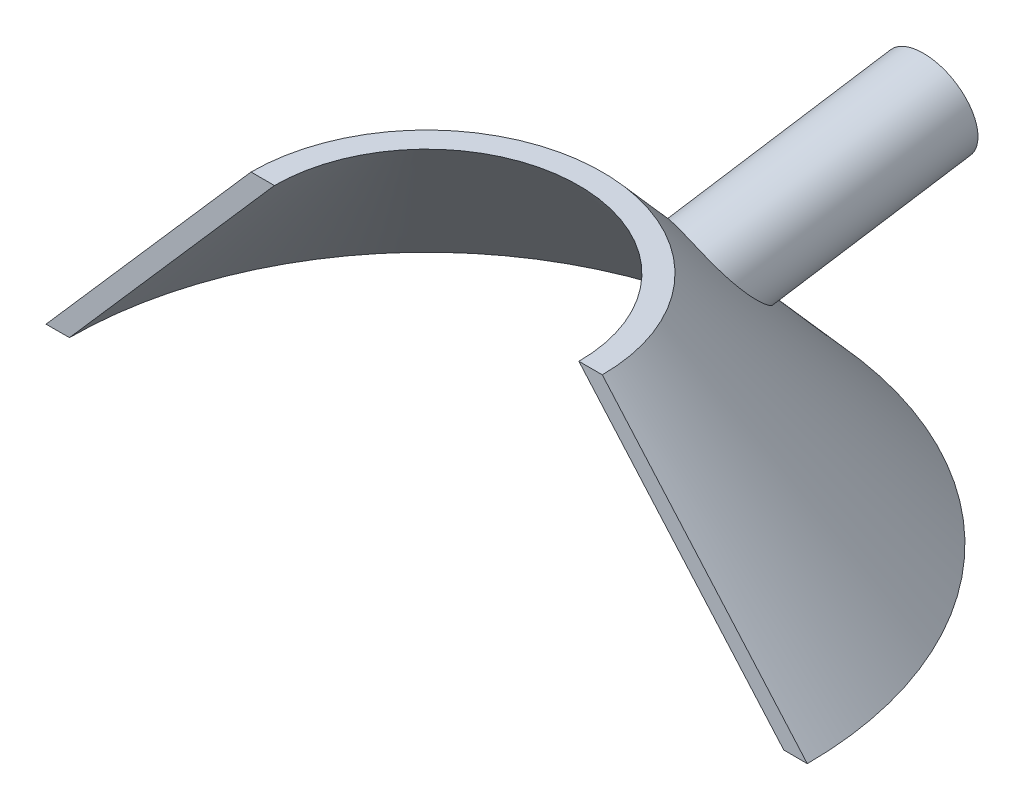
ISO-10303-21;
HEADER;
FILE_DESCRIPTION(('STEP AP214'),'2;1');
FILE_NAME('part.step','',(''),(''),'','','');
FILE_SCHEMA(('AUTOMOTIVE_DESIGN { 1 0 10303 214 1 1 1 1 }'));
ENDSEC;
DATA;
#1=APPLICATION_CONTEXT('core data for automotive mechanical design processes');
#2=APPLICATION_PROTOCOL_DEFINITION('international standard','automotive_design',2000,#1);
#3=PRODUCT_CONTEXT('',#1,'mechanical');
#4=PRODUCT('Part','Part','',(#3));
#5=PRODUCT_RELATED_PRODUCT_CATEGORY('part','',(#4));
#6=PRODUCT_DEFINITION_FORMATION('','',#4);
#7=PRODUCT_DEFINITION_CONTEXT('part definition',#1,'design');
#8=PRODUCT_DEFINITION('design','',#6,#7);
#9=PRODUCT_DEFINITION_SHAPE('','',#8);
#10=(LENGTH_UNIT() NAMED_UNIT(*) SI_UNIT(.MILLI.,.METRE.));
#11=(NAMED_UNIT(*) PLANE_ANGLE_UNIT() SI_UNIT($,.RADIAN.));
#12=(NAMED_UNIT(*) SI_UNIT($,.STERADIAN.) SOLID_ANGLE_UNIT());
#13=UNCERTAINTY_MEASURE_WITH_UNIT(LENGTH_MEASURE(1.E-05),#10,'distance_accuracy_value','');
#14=(GEOMETRIC_REPRESENTATION_CONTEXT(3) GLOBAL_UNCERTAINTY_ASSIGNED_CONTEXT((#13)) GLOBAL_UNIT_ASSIGNED_CONTEXT((#10,
#11,#12)) REPRESENTATION_CONTEXT('',''));
#15=CARTESIAN_POINT('',(0.,0.,0.));
#16=DIRECTION('',(0.,0.,1.));
#17=DIRECTION('',(1.,0.,0.));
#18=AXIS2_PLACEMENT_3D('',#15,#16,#17);
#19=CARTESIAN_POINT('',(-26.,40.,-1.81557029619843E-13));
#20=DIRECTION('',(0.,-1.,0.));
#21=DIRECTION('',(0.,0.,-1.));
#22=AXIS2_PLACEMENT_3D('',#19,#20,#21);
#23=PLANE('',#22);
#24=DIRECTION('',(-1.,0.,0.));
#25=VECTOR('',#24,1.);
#26=CARTESIAN_POINT('',(-26.,40.,0.));
#27=LINE('',#26,#25);
#28=CARTESIAN_POINT('',(30.,40.,0.));
#29=VERTEX_POINT('',#28);
#30=CARTESIAN_POINT('',(26.,40.,0.));
#31=VERTEX_POINT('',#30);
#32=EDGE_CURVE('E50',#29,#31,#27,.T.);
#33=ORIENTED_EDGE('',*,*,#32,.F.);
#34=CARTESIAN_POINT('',(0.,40.,0.));
#35=DIRECTION('',(0.,1.,0.));
#36=DIRECTION('',(0.,0.,1.));
#37=AXIS2_PLACEMENT_3D('',#34,#35,#36);
#38=CIRCLE('',#37,30.);
#39=CARTESIAN_POINT('',(-30.,40.,0.));
#40=VERTEX_POINT('',#39);
#41=EDGE_CURVE('E99',#29,#40,#38,.T.);
#42=ORIENTED_EDGE('',*,*,#41,.T.);
#43=CARTESIAN_POINT('',(-26.,40.,0.));
#44=VERTEX_POINT('',#43);
#45=EDGE_CURVE('E169',#44,#40,#27,.T.);
#46=ORIENTED_EDGE('',*,*,#45,.F.);
#47=CARTESIAN_POINT('',(0.,40.,0.));
#48=DIRECTION('',(0.,1.,0.));
#49=DIRECTION('',(0.,0.,1.));
#50=AXIS2_PLACEMENT_3D('',#47,#48,#49);
#51=CIRCLE('',#50,26.);
#52=EDGE_CURVE('E97',#31,#44,#51,.T.);
#53=ORIENTED_EDGE('',*,*,#52,.F.);
#54=EDGE_LOOP('',(#33,#42,#46,#53));
#55=FACE_BOUND('',#54,.T.);
#56=ADVANCED_FACE('F35',(#55),#23,.F.);
#57=CARTESIAN_POINT('',(0.,-0.0157867155627517,0.));
#58=DIRECTION('',(0.,-1.,0.));
#59=DIRECTION('',(0.,0.,-1.));
#60=AXIS2_PLACEMENT_3D('',#57,#58,#59);
#61=CONICAL_SURFACE('',#60,65.0138133761174,0.718829999621624);
#62=CARTESIAN_POINT('',(2.11778835466251,25.3432049363842,-42.7722986596035));
#63=CARTESIAN_POINT('',(2.05837024983885,25.5967091724343,-42.5531536370684));
#64=CARTESIAN_POINT('',(2.0146629317168,25.8519522119252,-42.3316314699707));
#65=CARTESIAN_POINT('',(1.95841450319368,26.3637883504045,-41.885929972183));
#66=CARTESIAN_POINT('',(1.94589586440639,26.6203822894098,-41.661748842477));
#67=CARTESIAN_POINT('',(1.95187543768074,27.1333207786515,-41.2121505340112));
#68=CARTESIAN_POINT('',(1.970454923976,27.3896629180138,-40.9867316558229));
#69=CARTESIAN_POINT('',(2.03860947993384,27.899124712044,-40.5370625812022));
#70=CARTESIAN_POINT('',(2.0881764502401,28.1522451911391,-40.3128120948202));
#71=CARTESIAN_POINT('',(2.21283021427869,28.6326337923969,-39.8851706809031));
#72=CARTESIAN_POINT('',(2.2855207178731,28.8603334331593,-39.6815632724077));
#73=CARTESIAN_POINT('',(2.45669351064718,29.3090979793261,-39.2779064826596));
#74=CARTESIAN_POINT('',(2.55517435628247,29.5301632552995,-39.0778569029361));
#75=CARTESIAN_POINT('',(2.7774942481713,29.9633265096628,-38.6827019920221));
#76=CARTESIAN_POINT('',(2.90130634245674,30.1754337322417,-38.4875916514895));
#77=CARTESIAN_POINT('',(3.17387087380948,30.5886800083893,-38.1032454051883));
#78=CARTESIAN_POINT('',(3.32262248176719,30.7898194262862,-37.9140093043797));
#79=CARTESIAN_POINT('',(3.6396122730346,31.1730146421218,-37.5480187771932));
#80=CARTESIAN_POINT('',(3.80714590347231,31.3554584285266,-37.371060812606));
#81=CARTESIAN_POINT('',(4.16414279177763,31.7055091467789,-37.02476144791));
#82=CARTESIAN_POINT('',(4.35360399083723,31.8731174689439,-36.8554193348086));
#83=CARTESIAN_POINT('',(4.75329438122443,32.191198196244,-36.5253594183006));
#84=CARTESIAN_POINT('',(4.963522627238,32.3416713806982,-36.3646412228476));
#85=CARTESIAN_POINT('',(5.40327991418681,32.6231734094234,-36.0528618035037));
#86=CARTESIAN_POINT('',(5.632806986843,32.7542042328528,-35.9017995975621));
#87=CARTESIAN_POINT('',(6.08833702681434,32.9839687799216,-35.6232662229043));
#88=CARTESIAN_POINT('',(6.31286485194527,33.0845318923771,-35.4948895087768));
#89=CARTESIAN_POINT('',(6.77487294009049,33.2659984399582,-35.2479370823975));
#90=CARTESIAN_POINT('',(7.01235147735112,33.3469044866957,-35.1293600695531));
#91=CARTESIAN_POINT('',(7.49838346454542,33.4875314474993,-34.9029908118166));
#92=CARTESIAN_POINT('',(7.74693342055622,33.5472589925125,-34.7951951988918));
#93=CARTESIAN_POINT('',(8.2531145036737,33.6441933470954,-34.5914285902636));
#94=CARTESIAN_POINT('',(8.51074457778745,33.6814027589884,-34.4954562292195));
#95=CARTESIAN_POINT('',(9.00568774952788,33.729501749745,-34.3258395843868));
#96=CARTESIAN_POINT('',(9.24233609958384,33.7427211992825,-34.2509118524185));
#97=CARTESIAN_POINT('',(9.71923099974895,33.7494509754894,-34.1125263103013));
#98=CARTESIAN_POINT('',(9.95947696950154,33.742964447698,-34.0490666712872));
#99=CARTESIAN_POINT('',(10.4414251090675,33.7098012887051,-33.9347365455134));
#100=CARTESIAN_POINT('',(10.6831262664857,33.683137375656,-33.8838581553682));
#101=CARTESIAN_POINT('',(11.1659147878287,33.609375414055,-33.7958202134505));
#102=CARTESIAN_POINT('',(11.4070022312597,33.5622801637345,-33.7586587843224));
#103=CARTESIAN_POINT('',(11.8583228902126,33.4543658537635,-33.702715582989));
#104=CARTESIAN_POINT('',(12.0688885578698,33.3957749895605,-33.6823008178056));
#105=CARTESIAN_POINT('',(12.4858763019324,33.26294755457,-33.6539524747895));
#106=CARTESIAN_POINT('',(12.6922990150258,33.1887134083168,-33.6460169644224));
#107=CARTESIAN_POINT('',(13.0989891406959,33.0251974368922,-33.6433628523612));
#108=CARTESIAN_POINT('',(13.2992616798211,32.9359285701146,-33.6486329226337));
#109=CARTESIAN_POINT('',(13.6919454591778,32.7431207642679,-33.6729557654406));
#110=CARTESIAN_POINT('',(13.8843574914651,32.6395832675833,-33.6920071456787));
#111=CARTESIAN_POINT('',(14.2387177149941,32.4315564157574,-33.7413585142388));
#112=CARTESIAN_POINT('',(14.4016810608831,32.328439815591,-33.7701807335052));
#113=CARTESIAN_POINT('',(14.7187453700452,32.1127799687993,-33.8390778808671));
#114=CARTESIAN_POINT('',(14.8728468504265,32.0002372731495,-33.8791521515778));
#115=CARTESIAN_POINT('',(15.1710945600556,31.7668584027662,-33.9704184098904));
#116=CARTESIAN_POINT('',(15.3152429289011,31.646024021683,-34.0216079981894));
#117=CARTESIAN_POINT('',(15.5927492613655,31.3972393957476,-34.1347872787403));
#118=CARTESIAN_POINT('',(15.7261071208545,31.2692890822459,-34.1967770751974));
#119=CARTESIAN_POINT('',(15.9770769699077,31.0119192639863,-34.3287910717432));
#120=CARTESIAN_POINT('',(16.0950674666382,30.8826935772534,-34.3984753289452));
#121=CARTESIAN_POINT('',(16.3199952934075,30.6198218451312,-34.5468906561284));
#122=CARTESIAN_POINT('',(16.4269290634093,30.4861743941952,-34.6256246228045));
#123=CARTESIAN_POINT('',(16.6294715516515,30.21557916167,-34.7914200478045));
#124=CARTESIAN_POINT('',(16.7250826522233,30.0786320816586,-34.8784797473706));
#125=CARTESIAN_POINT('',(16.9050017051711,29.8023250847853,-35.0602324243355));
#126=CARTESIAN_POINT('',(16.989305271919,29.6629642552762,-35.1549283407722));
#127=CARTESIAN_POINT('',(17.1542501466263,29.3692336314877,-35.3606225014161));
#128=CARTESIAN_POINT('',(17.2337567944512,29.2147109697508,-35.4723124617456));
#129=CARTESIAN_POINT('',(17.3795451549213,28.9048055477576,-35.7029453000408));
#130=CARTESIAN_POINT('',(17.4458224761187,28.7494225194369,-35.821890569342));
#131=CARTESIAN_POINT('',(17.6253592489131,28.2832299167748,-36.1881809476767));
#132=CARTESIAN_POINT('',(17.7193392744943,27.9723482081653,-36.4450007971442));
#133=CARTESIAN_POINT('',(17.8943517495434,27.2011470859002,-37.1100528157417));
#134=CARTESIAN_POINT('',(17.9454157289954,26.743828757027,-37.529786502159));
#135=CARTESIAN_POINT('',(17.9497766333613,26.0741400892618,-38.1758878803825));
#136=CARTESIAN_POINT('',(17.9391175299527,25.8532925436486,-38.3943600437689));
#137=CARTESIAN_POINT('',(17.894765442181,25.417709455813,-38.8351051410833));
#138=CARTESIAN_POINT('',(17.8610753433773,25.2029731514219,-39.0573775954708));
#139=CARTESIAN_POINT('',(17.7709002361369,24.7770785422509,-39.5074750528512));
#140=CARTESIAN_POINT('',(17.7140667417676,24.5660288255247,-39.7353325138944));
#141=CARTESIAN_POINT('',(17.5783981319223,24.1517393766909,-40.1915094309076));
#142=CARTESIAN_POINT('',(17.4995598494344,23.948500773582,-40.4198289486791));
#143=CARTESIAN_POINT('',(17.2312704979155,23.3525557445357,-41.1020075890175));
#144=CARTESIAN_POINT('',(17.0097115050135,22.9720744709512,-41.5547321704195));
#145=CARTESIAN_POINT('',(16.6694950479062,22.5063457277037,-42.1291099992976));
#146=CARTESIAN_POINT('',(16.5885593389116,22.4022364406057,-42.2589374707251));
#147=CARTESIAN_POINT('',(16.4193797948038,22.1975938706377,-42.5169647342816));
#148=CARTESIAN_POINT('',(16.3311281946354,22.0970645535357,-42.6451626259952));
#149=CARTESIAN_POINT('',(16.0701690866123,21.8170829392106,-43.0062871153867));
#150=CARTESIAN_POINT('',(15.8888181500308,21.6423099977999,-43.2366787567337));
#151=CARTESIAN_POINT('',(15.5014872719513,21.3077378000825,-43.6878077049118));
#152=CARTESIAN_POINT('',(15.2954908658262,21.1479486824168,-43.9085384216924));
#153=CARTESIAN_POINT('',(14.8590019900017,20.8456359085202,-44.3372320531009));
#154=CARTESIAN_POINT('',(14.6285144592933,20.7031087835166,-44.5451975287296));
#155=CARTESIAN_POINT('',(14.1432275956826,20.4379171069268,-44.9449589286064));
#156=CARTESIAN_POINT('',(13.8884336008603,20.3152482100498,-45.1367583858172));
#157=CARTESIAN_POINT('',(13.453598444329,20.1338861724111,-45.4331698034848));
#158=CARTESIAN_POINT('',(13.280560333028,20.0682638692168,-45.5438892241614));
#159=CARTESIAN_POINT('',(12.9255161627075,19.9471017574879,-45.7560954419741));
#160=CARTESIAN_POINT('',(12.7435116474726,19.8915602209645,-45.8575838199533));
#161=CARTESIAN_POINT('',(12.3712478259416,19.7915384762415,-46.0500360343663));
#162=CARTESIAN_POINT('',(12.1809947169344,19.747050127142,-46.1410075900922));
#163=CARTESIAN_POINT('',(11.7930205932267,19.6700637541708,-46.3112045685106));
#164=CARTESIAN_POINT('',(11.5953026681874,19.6375608282698,-46.3904347854539));
#165=CARTESIAN_POINT('',(11.1914659655391,19.5852031156248,-46.5366397659403));
#166=CARTESIAN_POINT('',(10.9852832849507,19.5654770658937,-46.6034850868748));
#167=CARTESIAN_POINT('',(10.5678952947204,19.5400628178475,-46.7227011232969));
#168=CARTESIAN_POINT('',(10.3566899444804,19.5343747330396,-46.7750717217429));
#169=CARTESIAN_POINT('',(9.93127107999039,19.5377262617303,-46.8642418576095));
#170=CARTESIAN_POINT('',(9.7170598746564,19.5467551252428,-46.9010527358887));
#171=CARTESIAN_POINT('',(9.28763756272839,19.5799473049075,-46.9583692694595));
#172=CARTESIAN_POINT('',(9.07242663413267,19.6041080222062,-46.9788777232748));
#173=CARTESIAN_POINT('',(8.67390088245117,19.6631168278983,-47.0014592977793));
#174=CARTESIAN_POINT('',(8.49040790346696,19.6959531966996,-47.0057416818314));
#175=CARTESIAN_POINT('',(8.12587090593842,19.772660428953,-47.002015731747));
#176=CARTESIAN_POINT('',(7.94482675807403,19.8165307073001,-46.9940080492118));
#177=CARTESIAN_POINT('',(7.58666006893805,19.9149581563703,-46.9659200783671));
#178=CARTESIAN_POINT('',(7.40953694252563,19.9695137203793,-46.9458416041678));
#179=CARTESIAN_POINT('',(7.06050604944184,20.0888123239716,-46.8940420037066));
#180=CARTESIAN_POINT('',(6.88859832965138,20.1535554550979,-46.8623207728225));
#181=CARTESIAN_POINT('',(6.55943418900087,20.2891869960531,-46.7896660131744));
#182=CARTESIAN_POINT('',(6.40187248233449,20.3596195392215,-46.749259358809));
#183=CARTESIAN_POINT('',(6.09331603354703,20.5085289344868,-46.6590786941264));
#184=CARTESIAN_POINT('',(5.94232337988668,20.587008318632,-46.6093017311696));
#185=CARTESIAN_POINT('',(5.64768780658295,20.7513105919431,-46.5011027943089));
#186=CARTESIAN_POINT('',(5.50404264688584,20.8371312213786,-46.4426834766237));
#187=CARTESIAN_POINT('',(5.22453028887082,21.0155000478554,-46.3178985882464));
#188=CARTESIAN_POINT('',(5.08866603481494,21.1080507618565,-46.2515300385828));
#189=CARTESIAN_POINT('',(4.81179699831234,21.3088952482027,-46.104499606923));
#190=CARTESIAN_POINT('',(4.67166652362596,21.4178339517896,-46.0230708319176));
#191=CARTESIAN_POINT('',(4.401707128341,21.6422285370255,-45.8524308040212));
#192=CARTESIAN_POINT('',(4.27188205228335,21.7576868236417,-45.7632166725332));
#193=CARTESIAN_POINT('',(3.89814970336614,22.1127486896058,-45.4851994735265));
#194=CARTESIAN_POINT('',(3.66999417731519,22.3610327708158,-45.2860264041852));
#195=CARTESIAN_POINT('',(3.21925300591958,22.921388764581,-44.8289053106564));
#196=CARTESIAN_POINT('',(3.00516021296432,23.2368692481921,-44.5668456574596));
#197=CARTESIAN_POINT('',(2.63652974875601,23.8842420695834,-44.0227225483765));
#198=CARTESIAN_POINT('',(2.48194009164208,24.2161197942593,-43.7406768099572));
#199=CARTESIAN_POINT('',(2.30809901092699,24.6833286935391,-43.3406916289912));
#200=CARTESIAN_POINT('',(2.26396820092174,24.8144609124958,-43.2281154307605));
#201=CARTESIAN_POINT('',(2.18438270375235,25.0779712106395,-43.0013433382213));
#202=CARTESIAN_POINT('',(2.14892799569913,25.210349286826,-42.8871474478131));
#203=CARTESIAN_POINT('',(2.11778835466251,25.3432049363842,-42.7722986596035));
#204=B_SPLINE_CURVE_WITH_KNOTS('',3,(#62,#63,#64,#65,#66,#67,#68,#69,#70,#71,#72,#73,#74,#75,
#76,#77,#78,#79,#80,#81,#82,#83,#84,#85,#86,#87,#88,#89,#90,#91,#92,#93,#94,#95,#96,#97,#98,#99,
#100,#101,#102,#103,#104,#105,#106,#107,#108,#109,#110,#111,#112,#113,#114,#115,#116,#117,#118,
#119,#120,#121,#122,#123,#124,#125,#126,#127,#128,#129,#130,#131,#132,#133,#134,#135,#136,#137,
#138,#139,#140,#141,#142,#143,#144,#145,#146,#147,#148,#149,#150,#151,#152,#153,#154,#155,#156,
#157,#158,#159,#160,#161,#162,#163,#164,#165,#166,#167,#168,#169,#170,#171,#172,#173,#174,#175,
#176,#177,#178,#179,#180,#181,#182,#183,#184,#185,#186,#187,#188,#189,#190,#191,#192,#193,#194,
#195,#196,#197,#198,#199,#200,#201,#202,#203),.UNSPECIFIED.,.T.,.F.,(4,2,2,2,2,2,2,2,2,2,2,2,2,
2,2,2,2,2,2,2,2,2,2,2,2,2,2,2,2,2,2,2,2,2,2,2,2,2,2,2,2,2,2,2,2,2,2,2,2,2,2,2,2,2,2,2,2,2,2,2,2,
2,2,2,2,2,2,2,2,2,4),(0.,1.02075736316887,2.04224997517305,3.06641640513355,4.09031525535915,
5.03115699062099,5.97194607607165,6.91173933728293,7.85150136143204,8.76353216631599,
9.67547740880056,10.5873811587353,11.4991920165509,12.3305707456418,13.1618389583696,
13.9928466723627,14.8237583320406,15.5684757538243,16.3130743073801,17.0572039182123,
17.8012316468385,18.4588761143528,19.1164187291763,19.7733974828202,20.4303098725706,
21.0145410032136,21.5987380080992,22.1828090359585,22.7668856995054,23.3313372471711,
23.8959699742808,24.4604836887129,25.0252157206079,25.6443365402706,26.2636625352886,
27.5022004123633,29.360003470032,30.2918261513293,31.2235321057068,32.1698191322717,
33.1162424223211,35.0023026217291,35.557368176232,36.1130306091114,37.135703654007,
38.1590637603433,39.1822178815213,40.2051478170728,40.8515772212006,41.4978957131361,
42.1437367575588,42.7893133597102,43.4412974315618,44.0932867751568,44.7448000869057,
45.3962015337371,45.9548466506888,46.5134621501173,47.0719937166249,47.6305303022435,
48.1617299184435,48.6930971998135,49.2243015039997,49.7557055033214,50.3409608162804,
50.9264334488787,52.097414377333,53.4804769740521,54.8623284785239,55.39728486092,
55.9322399553125),.UNSPECIFIED.);
#205=CARTESIAN_POINT('',(2.11778835466251,25.3432049363842,-42.7722986596035));
#206=VERTEX_POINT('',#205);
#207=EDGE_CURVE('E101',#206,#206,#204,.T.);
#208=ORIENTED_EDGE('',*,*,#207,.F.);
#209=EDGE_LOOP('',(#208));
#210=FACE_BOUND('',#209,.T.);
#211=DIRECTION('',(-0.658504607868518,-0.752576694706878,0.));
#212=VECTOR('',#211,1.);
#213=CARTESIAN_POINT('',(0.,74.2857142857143,0.));
#214=LINE('',#213,#212);
#215=CARTESIAN_POINT('',(-65.0138133761174,-0.0157867155627514,0.));
#216=VERTEX_POINT('',#215);
#217=EDGE_CURVE('E172',#40,#216,#214,.T.);
#218=ORIENTED_EDGE('',*,*,#217,.F.);
#219=ORIENTED_EDGE('',*,*,#41,.F.);
#220=DIRECTION('',(-0.658504607868518,0.752576694706878,0.));
#221=VECTOR('',#220,1.);
#222=CARTESIAN_POINT('',(0.,74.2857142857143,0.));
#223=LINE('',#222,#221);
#224=CARTESIAN_POINT('',(65.0138133761174,-0.0157867155627514,0.));
#225=VERTEX_POINT('',#224);
#226=EDGE_CURVE('E94',#225,#29,#223,.T.);
#227=ORIENTED_EDGE('',*,*,#226,.F.);
#228=CARTESIAN_POINT('',(0.,-0.0157867155627517,0.));
#229=DIRECTION('',(0.,1.,0.));
#230=DIRECTION('',(0.,0.,1.));
#231=AXIS2_PLACEMENT_3D('',#228,#229,#230);
#232=CIRCLE('',#231,65.0138133761174);
#233=EDGE_CURVE('E93',#225,#216,#232,.T.);
#234=ORIENTED_EDGE('',*,*,#233,.T.);
#235=EDGE_LOOP('',(#218,#219,#227,#234));
#236=FACE_BOUND('',#235,.T.);
#237=ADVANCED_FACE('F37',(#210,#236),#61,.T.);
#238=CARTESIAN_POINT('',(0.,0.,0.));
#239=DIRECTION('',(0.,-1.,0.));
#240=DIRECTION('',(0.,0.,-1.));
#241=AXIS2_PLACEMENT_3D('',#238,#239,#240);
#242=CONICAL_SURFACE('',#241,61.,1.56686325052021);
#243=DIRECTION('',(-0.999992265465479,-0.00393306613451107,0.));
#244=VECTOR('',#243,1.);
#245=CARTESIAN_POINT('',(0.,0.239918889866111,0.));
#246=LINE('',#245,#244);
#247=CARTESIAN_POINT('',(-61.,0.,0.));
#248=VERTEX_POINT('',#247);
#249=EDGE_CURVE('E57',#216,#248,#246,.F.);
#250=ORIENTED_EDGE('',*,*,#249,.F.);
#251=ORIENTED_EDGE('',*,*,#233,.F.);
#252=DIRECTION('',(-0.999992265465479,0.00393306613451107,0.));
#253=VECTOR('',#252,1.);
#254=CARTESIAN_POINT('',(0.,0.239918889866111,0.));
#255=LINE('',#254,#253);
#256=CARTESIAN_POINT('',(61.,0.,0.));
#257=VERTEX_POINT('',#256);
#258=EDGE_CURVE('E80',#257,#225,#255,.F.);
#259=ORIENTED_EDGE('',*,*,#258,.F.);
#260=CARTESIAN_POINT('',(0.,0.,0.));
#261=DIRECTION('',(0.,1.,0.));
#262=DIRECTION('',(0.,0.,1.));
#263=AXIS2_PLACEMENT_3D('',#260,#261,#262);
#264=CIRCLE('',#263,61.);
#265=EDGE_CURVE('E91',#257,#248,#264,.T.);
#266=ORIENTED_EDGE('',*,*,#265,.T.);
#267=EDGE_LOOP('',(#250,#251,#259,#266));
#268=FACE_BOUND('',#267,.T.);
#269=ADVANCED_FACE('F90',(#268),#242,.F.);
#270=CARTESIAN_POINT('',(0.,40.,0.));
#271=DIRECTION('',(0.,-1.,0.));
#272=DIRECTION('',(0.,0.,-1.));
#273=AXIS2_PLACEMENT_3D('',#270,#271,#272);
#274=CONICAL_SURFACE('',#273,26.,0.718829999621625);
#275=CARTESIAN_POINT('',(12.1313273111929,18.9037235749361,-42.7721297750715));
#276=CARTESIAN_POINT('',(11.7222017955815,19.0576283172528,-42.7481856846802));
#277=CARTESIAN_POINT('',(11.3107621343054,19.205444206621,-42.7251888818331));
#278=CARTESIAN_POINT('',(10.4831815569949,19.4879828385275,-42.6812322730921));
#279=CARTESIAN_POINT('',(10.0670393719394,19.622701947803,-42.6602730324516));
#280=CARTESIAN_POINT('',(8.8167339991327,20.0042088482922,-42.6009192037606));
#281=CARTESIAN_POINT('',(7.97585621409617,20.2301864790472,-42.5657622051148));
#282=CARTESIAN_POINT('',(6.70333011373241,20.5216600277175,-42.5204155257924));
#283=CARTESIAN_POINT('',(6.27712977404836,20.6109261635871,-42.5065277378402));
#284=CARTESIAN_POINT('',(5.42147387764977,20.7727837501532,-42.4813463650968));
#285=CARTESIAN_POINT('',(4.99201838818154,20.8453755443509,-42.4700527268646));
#286=CARTESIAN_POINT('',(4.12802744725613,20.9734857372074,-42.4501216838596));
#287=CARTESIAN_POINT('',(3.69347700663007,21.0289056088333,-42.4414996076603));
#288=CARTESIAN_POINT('',(2.82233332847799,21.1215588725451,-42.4270848593688));
#289=CARTESIAN_POINT('',(2.38573979829236,21.158789573301,-42.4212926059866));
#290=CARTESIAN_POINT('',(1.9485088405413,21.1866393430874,-42.4169598128893));
#291=B_SPLINE_CURVE_WITH_KNOTS('',3,(#275,#276,#277,#278,#279,#280,#281,#282,#283,#284,#285,
#286,#287,#288,#289,#290),.UNSPECIFIED.,.F.,.F.,(4,2,2,2,2,2,2,4),(0.,1.31318862591536,
2.62674051862443,5.23832680279947,6.54506890936445,7.85178409385778,9.16586359895152,
10.4801374807626),.UNSPECIFIED.);
#292=CARTESIAN_POINT('',(11.6444086546939,19.0835956707317,-42.7441457529045));
#293=VERTEX_POINT('',#292);
#294=CARTESIAN_POINT('',(4.63654231829645,20.8979935334507,-42.4618665600952));
#295=VERTEX_POINT('',#294);
#296=EDGE_CURVE('E107',#293,#295,#291,.T.);
#297=ORIENTED_EDGE('',*,*,#296,.F.);
#298=CARTESIAN_POINT('',(17.5858501149576,27.7677118481785,-32.2159369390578));
#299=CARTESIAN_POINT('',(17.641893817389,27.6060524066559,-32.3464938339182));
#300=CARTESIAN_POINT('',(17.69101114705,27.4448890309307,-32.480340340905));
#301=CARTESIAN_POINT('',(17.7759873145796,27.1239910518658,-32.7537433064809));
#302=CARTESIAN_POINT('',(17.8118501786835,26.9642560290541,-32.8932980167906));
#303=CARTESIAN_POINT('',(17.9347246229081,26.3036630396331,-33.4838757416615));
#304=CARTESIAN_POINT('',(17.9650458867184,25.8107341857407,-33.9569856134421));
#305=CARTESIAN_POINT('',(17.9275363206716,25.0940189347073,-34.6836189954293));
#306=CARTESIAN_POINT('',(17.9010326043935,24.8583408792107,-34.9292848241865));
#307=CARTESIAN_POINT('',(17.8215848843424,24.395165821934,-35.424156258061));
#308=CARTESIAN_POINT('',(17.7686474475553,24.1676668032588,-35.6733609690742));
#309=CARTESIAN_POINT('',(17.64017066331,23.730987722225,-36.1626458837421));
#310=CARTESIAN_POINT('',(17.5656649130884,23.5214393323096,-36.4026736515436));
#311=CARTESIAN_POINT('',(17.3940536525074,23.1112004434843,-36.8822496161259));
#312=CARTESIAN_POINT('',(17.2969473652604,22.9105102493549,-37.1217977961355));
#313=CARTESIAN_POINT('',(17.0806703579138,22.5189288135266,-37.5984606027076));
#314=CARTESIAN_POINT('',(16.9615230801696,22.3280274336064,-37.8355775349186));
#315=CARTESIAN_POINT('',(16.701315780218,21.9566578027316,-38.3059072174887));
#316=CARTESIAN_POINT('',(16.5602572227975,21.7761888554663,-38.5391202276745));
#317=CARTESIAN_POINT('',(16.2646538385391,21.4363940868881,-38.9870779696398));
#318=CARTESIAN_POINT('',(16.1112903938822,21.2764507731725,-39.2021297435249));
#319=CARTESIAN_POINT('',(15.7850574718227,20.9679500105285,-39.6253380773274));
#320=CARTESIAN_POINT('',(15.6121868610856,20.8193932239816,-39.8334942357109));
#321=CARTESIAN_POINT('',(15.0640901371721,20.3928338358945,-40.4446968008274));
#322=CARTESIAN_POINT('',(14.6588823502672,20.1333606462924,-40.8352451603248));
#323=CARTESIAN_POINT('',(14.0479214599143,19.8212355760025,-41.3349752422209));
#324=CARTESIAN_POINT('',(13.8750621460116,19.7403977854193,-41.4679450769151));
#325=CARTESIAN_POINT('',(13.5184090602065,19.5889517058532,-41.7248949515604));
#326=CARTESIAN_POINT('',(13.3346157390602,19.5183429955864,-41.848875361635));
#327=CARTESIAN_POINT('',(12.9567163373754,19.3885393331177,-42.0862655103206));
#328=CARTESIAN_POINT('',(12.7626198578036,19.3293339848761,-42.1996848278985));
#329=CARTESIAN_POINT('',(12.3646818379281,19.2234559328997,-42.4144982775228));
#330=CARTESIAN_POINT('',(12.1608456541487,19.1767764317187,-42.5158989150406));
#331=CARTESIAN_POINT('',(11.7805471107579,19.1040585429581,-42.6886605117413));
#332=CARTESIAN_POINT('',(11.6054789960655,19.0758432956848,-42.7621800542899));
#333=CARTESIAN_POINT('',(11.2501630024884,19.029467008078,-42.8989815843759));
#334=CARTESIAN_POINT('',(11.0699177655372,19.011300932185,-42.9622686880344));
#335=CARTESIAN_POINT('',(10.7051785799281,18.9856348025692,-43.0777429637237));
#336=CARTESIAN_POINT('',(10.5206853599753,18.9781329331429,-43.1299320240366));
#337=CARTESIAN_POINT('',(10.1486080297988,18.9743234259571,-43.2224197859266));
#338=CARTESIAN_POINT('',(9.96102388331483,18.9780159196141,-43.2627183479087));
#339=CARTESIAN_POINT('',(9.58314850958663,18.9970396089117,-43.3309447638005));
#340=CARTESIAN_POINT('',(9.39284816719612,19.0124329889902,-43.3588052555132));
#341=CARTESIAN_POINT('',(9.01210355343443,19.0551433544297,-43.4013716553148));
#342=CARTESIAN_POINT('',(8.82165928137112,19.0824603974979,-43.4160774997378));
#343=CARTESIAN_POINT('',(8.44232796712018,19.1490025589793,-43.4321186393438));
#344=CARTESIAN_POINT('',(8.25344064434585,19.1882254813419,-43.4334563987405));
#345=CARTESIAN_POINT('',(7.87886109225862,19.2783431836872,-43.4228275476798));
#346=CARTESIAN_POINT('',(7.69316866619523,19.3292372421437,-43.4108617594907));
#347=CARTESIAN_POINT('',(7.34275049823913,19.4372503004179,-43.3755921810569));
#348=CARTESIAN_POINT('',(7.17762063639311,19.4934235757052,-43.3533821662979));
#349=CARTESIAN_POINT('',(6.85235309695604,19.6146414716571,-43.2986000671906));
#350=CARTESIAN_POINT('',(6.69221711312973,19.6796890628545,-43.26602450826));
#351=CARTESIAN_POINT('',(6.3779958762032,19.818052619337,-43.191083357593));
#352=CARTESIAN_POINT('',(6.22390872554438,19.8913659632002,-43.1487208652634));
#353=CARTESIAN_POINT('',(5.92246052636435,20.0456799936158,-43.0548376541704));
#354=CARTESIAN_POINT('',(5.77510209357115,20.1266836326509,-43.0033134113173));
#355=CARTESIAN_POINT('',(5.48128805383848,20.2995347014819,-42.8893001374847));
#356=CARTESIAN_POINT('',(5.33517522212733,20.3917070013173,-42.8264203618907));
#357=CARTESIAN_POINT('',(5.05155888335633,20.582978985122,-42.6922744756736));
#358=CARTESIAN_POINT('',(4.91405847282574,20.6820811338681,-42.6210053749516));
#359=CARTESIAN_POINT('',(4.51513367330927,20.988669119752,-42.3958819478822));
#360=CARTESIAN_POINT('',(4.26714648370571,21.2055192606086,-42.230656258071));
#361=CARTESIAN_POINT('',(3.7729027287005,21.6943505408443,-41.8484251472135));
#362=CARTESIAN_POINT('',(3.5331029565376,21.9696301666225,-41.6273631842898));
#363=CARTESIAN_POINT('',(3.10456293424109,22.5392894440356,-41.1616687558146));
#364=CARTESIAN_POINT('',(2.91585562232328,22.8336812660188,-40.9170212222926));
#365=CARTESIAN_POINT('',(2.55698499169224,23.4949527660478,-40.361382520307));
#366=CARTESIAN_POINT('',(2.39771809175822,23.8647249448084,-40.0467903491353));
#367=CARTESIAN_POINT('',(2.15027405009179,24.6152709334517,-39.403148236864));
#368=CARTESIAN_POINT('',(2.06213865272438,24.9960510679195,-39.0740899253986));
#369=CARTESIAN_POINT('',(1.94740023399397,25.8226222886395,-38.3558287764995));
#370=CARTESIAN_POINT('',(1.93289447677394,26.2690698040329,-37.9654246038653));
#371=CARTESIAN_POINT('',(1.99717362656031,27.156236156298,-37.1847390332936));
#372=CARTESIAN_POINT('',(2.07603951703574,27.5969496845744,-36.7944580360321));
#373=CARTESIAN_POINT('',(2.26741853364505,28.2577120783075,-36.2036460701048));
#374=CARTESIAN_POINT('',(2.34699639542969,28.4846570100161,-35.999654034854));
#375=CARTESIAN_POINT('',(2.53205252062919,28.9313102314475,-35.5953186699012));
#376=CARTESIAN_POINT('',(2.63753500481402,29.151017335252,-35.3949759405186));
#377=CARTESIAN_POINT('',(2.87374192818346,29.5804603569414,-34.9995682875852));
#378=CARTESIAN_POINT('',(3.00441470503601,29.7902156061612,-34.8044934780322));
#379=CARTESIAN_POINT('',(3.29048728592884,30.1978351574387,-34.4203405350697));
#380=CARTESIAN_POINT('',(3.44587512734303,30.3957051487112,-34.2312595533481));
#381=CARTESIAN_POINT('',(3.77107461037281,30.7663941335834,-33.8705714259908));
#382=CARTESIAN_POINT('',(3.93956838671817,30.9399974276608,-33.6985814480021));
#383=CARTESIAN_POINT('',(4.29699576129194,31.2725382705567,-33.3615209354051));
#384=CARTESIAN_POINT('',(4.48593820108328,31.4314694199779,-33.1964534370725));
#385=CARTESIAN_POINT('',(4.85946058297569,31.7146174813342,-32.8932540091274));
#386=CARTESIAN_POINT('',(5.04190786097761,31.8407165381844,-32.7542470621552));
#387=CARTESIAN_POINT('',(5.4206965179715,32.0783638131608,-32.4828983562561));
#388=CARTESIAN_POINT('',(5.61703638348163,32.1899136125543,-32.3505558739718));
#389=CARTESIAN_POINT('',(6.02243510250834,32.397069125051,-32.0931404233665));
#390=CARTESIAN_POINT('',(6.23149195695469,32.4926773353269,-31.9680663184929));
#391=CARTESIAN_POINT('',(6.66094771310311,32.6666142292844,-31.7258563955582));
#392=CARTESIAN_POINT('',(6.88134045794331,32.7449521732586,-31.608716346726));
#393=CARTESIAN_POINT('',(7.28096368781417,32.8675061181632,-31.4086141492765));
#394=CARTESIAN_POINT('',(7.45820114916396,32.9154316003427,-31.3239233558725));
#395=CARTESIAN_POINT('',(7.81760172724815,32.9996787299002,-31.1601757860148));
#396=CARTESIAN_POINT('',(7.99975664829291,33.0360185305123,-31.0811103479078));
#397=CARTESIAN_POINT('',(8.1841485760151,33.0663594060956,-31.0049684035987));
#398=B_SPLINE_CURVE_WITH_KNOTS('',3,(#298,#299,#300,#301,#302,#303,#304,#305,#306,#307,#308,
#309,#310,#311,#312,#313,#314,#315,#316,#317,#318,#319,#320,#321,#322,#323,#324,#325,#326,#327,
#328,#329,#330,#331,#332,#333,#334,#335,#336,#337,#338,#339,#340,#341,#342,#343,#344,#345,#346,
#347,#348,#349,#350,#351,#352,#353,#354,#355,#356,#357,#358,#359,#360,#361,#362,#363,#364,#365,
#366,#367,#368,#369,#370,#371,#372,#373,#374,#375,#376,#377,#378,#379,#380,#381,#382,#383,#384,
#385,#386,#387,#388,#389,#390,#391,#392,#393,#394,#395,#396,#397),.UNSPECIFIED.,.F.,.F.,(4,2,2,
2,2,2,2,2,2,2,2,2,2,2,2,2,2,2,2,2,2,2,2,2,2,2,2,2,2,2,2,2,2,2,2,2,2,2,2,2,2,2,2,2,2,2,2,2,2,4),
(0.,0.645197013966096,1.29019787863055,3.32746640543209,4.35115939875008,5.37459820025886,
6.35539577612792,7.33622707164708,8.31602111063116,9.29574967775011,10.2211571578843,
11.146618430384,12.9943210649452,13.6916242182713,14.3888986450655,15.0855343510643,
15.7817912432005,16.3571244069956,16.9321690141806,17.5071157016954,18.0820691388424,
18.6600997204561,19.23813309961,19.8160599246806,20.3939510311162,20.9208429682154,
21.4479117085218,21.9748137606061,22.5019189270198,23.0528828849395,23.6040438138373,
24.7058572939414,25.9816555105846,27.25827425916,28.7852815605841,30.3131843540307,
32.0854803822732,33.8593146921229,34.8044010967789,35.749641591384,36.6929637456023,
37.6358306932114,38.5252229338072,39.4150012765658,40.1994192231989,40.9837518452047,
41.7679614896463,42.5517496137001,43.1578811450595,43.7630582267506),.UNSPECIFIED.);
#399=EDGE_CURVE('E86',#293,#295,#398,.T.);
#400=ORIENTED_EDGE('',*,*,#399,.T.);
#401=EDGE_LOOP('',(#297,#400));
#402=FACE_BOUND('',#401,.T.);
#403=CARTESIAN_POINT('',(6.32149907395029,21.3912016081101,-41.8074783950536));
#404=CARTESIAN_POINT('',(6.17088188614867,21.4844080076306,-41.747769844338));
#405=CARTESIAN_POINT('',(6.02550211329526,21.5824341542696,-41.6823009128445));
#406=CARTESIAN_POINT('',(5.74600869702646,21.7869428421676,-41.5411080387903));
#407=CARTESIAN_POINT('',(5.61190274913583,21.8934310647289,-41.4653771820648));
#408=CARTESIAN_POINT('',(5.35523006733637,22.1139462634595,-41.3047504456431));
#409=CARTESIAN_POINT('',(5.23269331501426,22.2279915903573,-41.2198319142398));
#410=CARTESIAN_POINT('',(4.99980460076511,22.4623172077811,-41.042185163235));
#411=CARTESIAN_POINT('',(4.88945847488202,22.5826004444533,-40.9494532402352));
#412=CARTESIAN_POINT('',(4.57884639841989,22.9490929609122,-40.6629671625317));
#413=CARTESIAN_POINT('',(4.39655528980938,23.2030855478704,-40.4593475540408));
#414=CARTESIAN_POINT('',(4.08061376915453,23.7246120506993,-40.0337594893816));
#415=CARTESIAN_POINT('',(3.94693532160513,23.9921380599452,-39.811801699998));
#416=CARTESIAN_POINT('',(3.70963990678926,24.5786123301985,-39.3192380580597));
#417=CARTESIAN_POINT('',(3.61407843960133,24.8990211132143,-39.0464774783437));
#418=CARTESIAN_POINT('',(3.48504558303685,25.5441764210853,-38.4914162431401));
#419=CARTESIAN_POINT('',(3.45162389501541,25.868926209114,-38.2091081348196));
#420=CARTESIAN_POINT('',(3.44528625180471,26.562329388066,-37.600460965588));
#421=CARTESIAN_POINT('',(3.48170077132734,26.9306238784045,-37.2735956293781));
#422=CARTESIAN_POINT('',(3.63271474366953,27.6542148640327,-36.6229891739191));
#423=CARTESIAN_POINT('',(3.74734166866083,28.0095067459282,-36.2992491929883));
#424=CARTESIAN_POINT('',(3.97970145708168,28.5317274436937,-35.8144311857994));
#425=CARTESIAN_POINT('',(4.06988072745402,28.7076781369439,-35.6494120873753));
#426=CARTESIAN_POINT('',(4.27062283199157,29.0512175025266,-35.3231580158645));
#427=CARTESIAN_POINT('',(4.38117753351295,29.2188094773633,-35.1619215618177));
#428=CARTESIAN_POINT('',(4.62220712452406,29.5439261362766,-34.8441023372284));
#429=CARTESIAN_POINT('',(4.75268960125233,29.7014469533486,-34.6875213664426));
#430=CARTESIAN_POINT('',(5.03279781441322,30.0044204299896,-34.3800857503518));
#431=CARTESIAN_POINT('',(5.18241373463663,30.1498792152129,-34.2292282198009));
#432=CARTESIAN_POINT('',(5.4927501257087,30.42059947375,-33.9408212404727));
#433=CARTESIAN_POINT('',(5.65265989842409,30.5464775718567,-33.8029785182042));
#434=CARTESIAN_POINT('',(5.9881250421476,30.7837946290156,-33.5342521795241));
#435=CARTESIAN_POINT('',(6.16367265077088,30.8952406852434,-33.4033651613552));
#436=CARTESIAN_POINT('',(6.52930035767184,31.1020598106931,-33.1494033902183));
#437=CARTESIAN_POINT('',(6.7193800175231,31.1974333645382,-33.0263284017692));
#438=CARTESIAN_POINT('',(7.11266712349295,31.3704376907075,-32.7889863568336));
#439=CARTESIAN_POINT('',(7.31587302275633,31.4480705488002,-32.6747182659705));
#440=CARTESIAN_POINT('',(7.71353560897195,31.5774254262921,-32.4666638050236));
#441=CARTESIAN_POINT('',(7.90693705309686,31.6309274923234,-32.3719654211663));
#442=CARTESIAN_POINT('',(8.30169122191504,31.7210578536532,-32.1915503252099));
#443=CARTESIAN_POINT('',(8.50304268619558,31.7576888121619,-32.1058321971725));
#444=CARTESIAN_POINT('',(8.91202864977234,31.8130717130452,-31.9444099059127));
#445=CARTESIAN_POINT('',(9.11966017755873,31.8318319787856,-31.8687010949643));
#446=CARTESIAN_POINT('',(9.53947783329588,31.8506354009315,-31.7283804574987));
#447=CARTESIAN_POINT('',(9.75166324750778,31.8506814693298,-31.6637669060853));
#448=CARTESIAN_POINT('',(10.1523814632867,31.8325732466572,-31.554036133181));
#449=CARTESIAN_POINT('',(10.340628220194,31.8166474117157,-31.5075002983443));
#450=CARTESIAN_POINT('',(10.7174933714131,31.7695772678335,-31.4248256337394));
#451=CARTESIAN_POINT('',(10.9061116866496,31.7384359082074,-31.3886847912047));
#452=CARTESIAN_POINT('',(11.2818511199659,31.6608690664261,-31.3277472335029));
#453=CARTESIAN_POINT('',(11.4689735344193,31.6144587325991,-31.3029393329695));
#454=CARTESIAN_POINT('',(11.8400418173941,31.5064865743524,-31.2655211504356));
#455=CARTESIAN_POINT('',(12.0239881928658,31.4449271923594,-31.2529089037877));
#456=CARTESIAN_POINT('',(12.3622722571044,31.316399562329,-31.2415091726082));
#457=CARTESIAN_POINT('',(12.5172597562698,31.2512778637651,-31.2410878391568));
#458=CARTESIAN_POINT('',(12.8220629323531,31.1105221433273,-31.2503958372827));
#459=CARTESIAN_POINT('',(12.9718793169747,31.0348895671197,-31.2601237741242));
#460=CARTESIAN_POINT('',(13.264958312596,30.8738448831409,-31.2899993283113));
#461=CARTESIAN_POINT('',(13.408224945881,30.7884388933914,-31.3101404546267));
#462=CARTESIAN_POINT('',(13.6870741522915,30.6086833111579,-31.360939324836));
#463=CARTESIAN_POINT('',(13.8226571300582,30.514334190343,-31.391596514326));
#464=CARTESIAN_POINT('',(14.07286560799,30.3268544805926,-31.4599912802761));
#465=CARTESIAN_POINT('',(14.1882686091887,30.2344222993916,-31.496808591112));
#466=CARTESIAN_POINT('',(14.4112024221349,30.0438701234466,-31.5787987061459));
#467=CARTESIAN_POINT('',(14.5187307934399,29.945748382179,-31.6239740854421));
#468=CARTESIAN_POINT('',(14.7252913413082,29.7447771903804,-31.722299079667));
#469=CARTESIAN_POINT('',(14.8243268274795,29.6419296056893,-31.7754455659211));
#470=CARTESIAN_POINT('',(15.0136067782965,29.4323244983246,-31.8892833469516));
#471=CARTESIAN_POINT('',(15.1038477709684,29.3255654541501,-31.9499776001578));
#472=CARTESIAN_POINT('',(15.2772040366787,29.1065910132118,-32.0798019622073));
#473=CARTESIAN_POINT('',(15.3601133443181,28.9943068980693,-32.1490911269617));
#474=CARTESIAN_POINT('',(15.5163927266371,28.7674295876741,-32.2943400271612));
#475=CARTESIAN_POINT('',(15.5897597333667,28.6528356634032,-32.3703018948639));
#476=CARTESIAN_POINT('',(15.7955963171516,28.3067094285555,-32.6072594888437));
#477=CARTESIAN_POINT('',(15.9138554800964,28.072763465185,-32.777368434106));
#478=CARTESIAN_POINT('',(16.0847765197431,27.6717130955005,-33.0844628534158));
#479=CARTESIAN_POINT('',(16.1465206883068,27.5047850160795,-33.2168570965617));
#480=CARTESIAN_POINT('',(16.2522917854087,27.1716910018333,-33.4895016435817));
#481=CARTESIAN_POINT('',(16.2963177413223,27.0055251093425,-33.6297523782491));
#482=CARTESIAN_POINT('',(16.3675323365194,26.6747671135618,-33.9167903052697));
#483=CARTESIAN_POINT('',(16.3946905533993,26.5101783779674,-34.0635887991064));
#484=CARTESIAN_POINT('',(16.4328980929811,26.1836731517848,-34.3621274552584));
#485=CARTESIAN_POINT('',(16.4439471404527,26.0217567069004,-34.5138677019598));
#486=CARTESIAN_POINT('',(16.4515753610549,25.6602344244395,-34.8603762498862));
#487=CARTESIAN_POINT('',(16.4437354547343,25.461570554883,-35.0562313046762));
#488=CARTESIAN_POINT('',(16.4052040731716,25.070376755411,-35.4518021696359));
#489=CARTESIAN_POINT('',(16.3745068605369,24.8778483782148,-35.651518936869));
#490=CARTESIAN_POINT('',(16.2912883410491,24.4996319410001,-36.0530926015184));
#491=CARTESIAN_POINT('',(16.2387533590105,24.3139482467015,-36.2549507625896));
#492=CARTESIAN_POINT('',(16.1126616858294,23.9502985086909,-36.6590044150256));
#493=CARTESIAN_POINT('',(16.0391066622575,23.7723318540567,-36.8611998783669));
#494=CARTESIAN_POINT('',(15.8707381434111,23.4232104504535,-37.266267095327));
#495=CARTESIAN_POINT('',(15.7757308605798,23.2521356923256,-37.469127268079));
#496=CARTESIAN_POINT('',(15.5652017612061,22.919446360953,-37.8719904911513));
#497=CARTESIAN_POINT('',(15.4496780324402,22.7578326713902,-38.0719932732712));
#498=CARTESIAN_POINT('',(15.1983915782907,22.4452289302488,-38.4672553870415));
#499=CARTESIAN_POINT('',(15.0626442224596,22.2942309381213,-38.6625181910507));
#500=CARTESIAN_POINT('',(14.7709237822074,22.0040022455485,-39.0465352915364));
#501=CARTESIAN_POINT('',(14.614956013985,21.8647684679809,-39.235291282281));
#502=CARTESIAN_POINT('',(14.3190163023121,21.6285099135069,-39.5639398727591));
#503=CARTESIAN_POINT('',(14.1829719899017,21.5289014129339,-39.7055126390539));
#504=CARTESIAN_POINT('',(13.8986036993218,21.338723291942,-39.9821601070519));
#505=CARTESIAN_POINT('',(13.750280314198,21.2481532354564,-40.1172351220813));
#506=CARTESIAN_POINT('',(13.2873147989003,20.9917205117069,-40.5104505888198));
#507=CARTESIAN_POINT('',(12.954108522651,20.8406727684262,-40.7572240002058));
#508=CARTESIAN_POINT('',(12.3165383069755,20.6152659290441,-41.1595509404669));
#509=CARTESIAN_POINT('',(12.0207811719242,20.5314670981168,-41.3233813546141));
#510=CARTESIAN_POINT('',(11.5588106140152,20.4337239214713,-41.5427379782241));
#511=CARTESIAN_POINT('',(11.4017095894618,20.4057974307082,-41.6114770627803));
#512=CARTESIAN_POINT('',(11.0821860208704,20.3600052382314,-41.7391677188865));
#513=CARTESIAN_POINT('',(10.9197658550358,20.34213510356,-41.7981235948936));
#514=CARTESIAN_POINT('',(10.5891030382106,20.3170275371332,-41.9057813913771));
#515=CARTESIAN_POINT('',(10.4208209815783,20.3098878510958,-41.9543856269035));
#516=CARTESIAN_POINT('',(10.0811606320134,20.307153731215,-42.0397550813146));
#517=CARTESIAN_POINT('',(9.90978228674499,20.3115594927032,-42.0765200998858));
#518=CARTESIAN_POINT('',(9.56559804732189,20.3323419436939,-42.1374514382202));
#519=CARTESIAN_POINT('',(9.3927929613223,20.3487122619658,-42.1616244516064));
#520=CARTESIAN_POINT('',(9.04743987728771,20.3936139379514,-42.1968993927195));
#521=CARTESIAN_POINT('',(8.87489183781505,20.4221430584874,-42.2080037236258));
#522=CARTESIAN_POINT('',(8.55636682368079,20.4863451018322,-42.2163196671921));
#523=CARTESIAN_POINT('',(8.41010876921855,20.5204197046976,-42.2152862131745));
#524=CARTESIAN_POINT('',(8.12028357887224,20.5972340302344,-42.2035489366172));
#525=CARTESIAN_POINT('',(7.97671629894041,20.6399732875968,-42.1928456332606));
#526=CARTESIAN_POINT('',(7.6935386073012,20.7337114235634,-42.1620259274029));
#527=CARTESIAN_POINT('',(7.55392367956263,20.7847003880286,-42.1419207694909));
#528=CARTESIAN_POINT('',(7.27949460722342,20.8944947951536,-42.0926983926814));
#529=CARTESIAN_POINT('',(7.14467896683902,20.9532977749093,-42.0635840095808));
#530=CARTESIAN_POINT('',(6.89245770417582,21.0725985503902,-41.9998356364071));
#531=CARTESIAN_POINT('',(6.77457289916892,21.1324752604613,-41.9659274355974));
#532=CARTESIAN_POINT('',(6.54403085710356,21.2577818180396,-41.89152555025));
#533=CARTESIAN_POINT('',(6.4313714401756,21.3232093171098,-41.851034644156));
#534=CARTESIAN_POINT('',(6.32149907395029,21.3912016081101,-41.8074783950536));
#535=B_SPLINE_CURVE_WITH_KNOTS('',3,(#403,#404,#405,#406,#407,#408,#409,#410,#411,#412,#413,
#414,#415,#416,#417,#418,#419,#420,#421,#422,#423,#424,#425,#426,#427,#428,#429,#430,#431,#432,
#433,#434,#435,#436,#437,#438,#439,#440,#441,#442,#443,#444,#445,#446,#447,#448,#449,#450,#451,
#452,#453,#454,#455,#456,#457,#458,#459,#460,#461,#462,#463,#464,#465,#466,#467,#468,#469,#470,
#471,#472,#473,#474,#475,#476,#477,#478,#479,#480,#481,#482,#483,#484,#485,#486,#487,#488,#489,
#490,#491,#492,#493,#494,#495,#496,#497,#498,#499,#500,#501,#502,#503,#504,#505,#506,#507,#508,
#509,#510,#511,#512,#513,#514,#515,#516,#517,#518,#519,#520,#521,#522,#523,#524,#525,#526,#527,
#528,#529,#530,#531,#532,#533,#534),.UNSPECIFIED.,.T.,.F.,(4,2,2,2,2,2,2,2,2,2,2,2,2,2,2,2,2,2,
2,2,2,2,2,2,2,2,2,2,2,2,2,2,2,2,2,2,2,2,2,2,2,2,2,2,2,2,2,2,2,2,2,2,2,2,2,2,2,2,2,2,2,2,2,2,2,
4),(0.,0.560592222966886,1.12156405114925,1.68395187685517,2.24660777952374,3.36119970353497,
4.47514780576489,5.76461613321954,7.05511537516762,8.53005865864211,10.0055202840376,
10.7773033486461,11.5487790285082,12.3205491732496,13.0919249461778,13.8283374846217,
14.5643864945644,15.3004133069472,16.0363535402941,16.7011010031825,17.3657434955134,
18.0300762756551,18.6943056833096,19.2771814712776,19.8599443217953,20.4421307487935,
21.0242233733886,21.5278806984072,22.0314688188153,22.534743406897,23.0379914665587,
23.4945699956446,23.9512894303047,24.4078300685943,24.8645502203507,25.3315446240905,
25.7986888022296,26.732689028617,27.3973910949074,28.0621296444136,28.7280636512316,
29.3940090356144,30.2301280285901,31.0664569658467,31.9033104174885,32.7400974979416,
33.5847696291092,34.4295205288119,35.2736326791031,36.1175233501327,36.7774051539446,
37.4372551058366,38.7540608017334,39.7947014791187,40.3153665527128,40.8358019309916,
41.3609499165417,41.8861067868665,42.4109842101564,42.935765099483,43.3857300621995,
43.8356708673162,44.2850749155375,44.7343376503299,45.1434512198837,45.5523925560212),.UNSPECIFIED.);
#536=CARTESIAN_POINT('',(6.32149907395029,21.3912016081101,-41.8074783950536));
#537=VERTEX_POINT('',#536);
#538=EDGE_CURVE('E141',#537,#537,#535,.T.);
#539=ORIENTED_EDGE('',*,*,#538,.T.);
#540=EDGE_LOOP('',(#539));
#541=FACE_BOUND('',#540,.T.);
#542=DIRECTION('',(-0.658504607868518,-0.752576694706878,0.));
#543=VECTOR('',#542,1.);
#544=CARTESIAN_POINT('',(0.,69.7142857142857,0.));
#545=LINE('',#544,#543);
#546=EDGE_CURVE('E11',#248,#44,#545,.F.);
#547=ORIENTED_EDGE('',*,*,#546,.F.);
#548=ORIENTED_EDGE('',*,*,#265,.F.);
#549=DIRECTION('',(-0.658504607868518,0.752576694706878,0.));
#550=VECTOR('',#549,1.);
#551=CARTESIAN_POINT('',(0.,69.7142857142857,0.));
#552=LINE('',#551,#550);
#553=EDGE_CURVE('E43',#31,#257,#552,.F.);
#554=ORIENTED_EDGE('',*,*,#553,.F.);
#555=ORIENTED_EDGE('',*,*,#52,.T.);
#556=EDGE_LOOP('',(#547,#548,#554,#555));
#557=FACE_BOUND('',#556,.T.);
#558=ADVANCED_FACE('F96',(#402,#541,#557),#274,.F.);
#559=CARTESIAN_POINT('',(9.94845087066054,26.8088291706217,-41.542274475706));
#560=DIRECTION('',(0.,0.153728022987189,-0.988113199460695));
#561=DIRECTION('',(0.,0.988113199460694,0.153728022987189));
#562=AXIS2_PLACEMENT_3D('',#559,#560,#561);
#563=PLANE('',#562);
#564=CARTESIAN_POINT('',(9.94845087066054,26.8088291706217,-41.542274475706));
#565=DIRECTION('',(0.,0.153728022987189,-0.988113199460695));
#566=DIRECTION('',(0.,0.988113199460694,0.153728022987189));
#567=AXIS2_PLACEMENT_3D('',#564,#565,#566);
#568=CIRCLE('',#567,8.);
#569=EDGE_CURVE('E138',#293,#295,#568,.T.);
#570=ORIENTED_EDGE('',*,*,#569,.F.);
#571=ORIENTED_EDGE('',*,*,#296,.T.);
#572=EDGE_LOOP('',(#570,#571));
#573=FACE_BOUND('',#572,.T.);
#574=ADVANCED_FACE('F121',(#573),#563,.F.);
#575=CARTESIAN_POINT('',(9.94845087066054,9.95384074289692,66.7960506947152));
#576=DIRECTION('',(0.,0.153728022987189,-0.988113199460695));
#577=DIRECTION('',(0.,0.988113199460695,0.153728022987189));
#578=AXIS2_PLACEMENT_3D('',#575,#576,#577);
#579=CYLINDRICAL_SURFACE('',#578,8.);
#580=ORIENTED_EDGE('',*,*,#399,.F.);
#581=ORIENTED_EDGE('',*,*,#569,.T.);
#582=EDGE_LOOP('',(#580,#581));
#583=FACE_BOUND('',#582,.T.);
#584=ADVANCED_FACE('F126',(#583),#579,.T.);
#585=CARTESIAN_POINT('',(9.94845087066054,32.1893099751733,-76.1262364568303));
#586=DIRECTION('',(0.,0.153728022987189,-0.988113199460695));
#587=DIRECTION('',(0.,0.988113199460694,0.153728022987189));
#588=AXIS2_PLACEMENT_3D('',#585,#586,#587);
#589=CIRCLE('',#588,8.);
#590=CARTESIAN_POINT('',(9.94845087066054,40.0942155708589,-74.8964122729328));
#591=VERTEX_POINT('',#590);
#592=EDGE_CURVE('E137',#591,#591,#589,.T.);
#593=ORIENTED_EDGE('',*,*,#592,.F.);
#594=EDGE_LOOP('',(#593));
#595=FACE_BOUND('',#594,.T.);
#596=ORIENTED_EDGE('',*,*,#207,.T.);
#597=EDGE_LOOP('',(#596));
#598=FACE_BOUND('',#597,.T.);
#599=ADVANCED_FACE('F131',(#595,#598),#579,.T.);
#600=CARTESIAN_POINT('',(9.94845087066054,32.1893099751733,-76.1262364568303));
#601=DIRECTION('',(0.,0.153728022987189,-0.988113199460695));
#602=DIRECTION('',(0.,0.988113199460694,0.153728022987189));
#603=AXIS2_PLACEMENT_3D('',#600,#601,#602);
#604=PLANE('',#603);
#605=CARTESIAN_POINT('',(9.94845087066054,32.1893099751733,-76.1262364568303));
#606=DIRECTION('',(0.,0.153728022987189,-0.988113199460695));
#607=DIRECTION('',(0.,0.988113199460694,0.153728022987189));
#608=AXIS2_PLACEMENT_3D('',#605,#606,#607);
#609=CIRCLE('',#608,6.5);
#610=CARTESIAN_POINT('',(9.94845087066054,38.6120457716678,-75.1270043074136));
#611=VERTEX_POINT('',#610);
#612=EDGE_CURVE('E148',#611,#611,#609,.T.);
#613=ORIENTED_EDGE('',*,*,#612,.F.);
#614=EDGE_LOOP('',(#613));
#615=FACE_BOUND('',#614,.T.);
#616=ORIENTED_EDGE('',*,*,#592,.T.);
#617=EDGE_LOOP('',(#616));
#618=FACE_BOUND('',#617,.T.);
#619=ADVANCED_FACE('F128',(#615,#618),#604,.T.);
#620=CARTESIAN_POINT('',(9.94845087066054,25.2715489407498,-31.6611424810991));
#621=DIRECTION('',(0.,0.153728022987189,-0.988113199460695));
#622=DIRECTION('',(0.,0.988113199460695,0.153728022987189));
#623=AXIS2_PLACEMENT_3D('',#620,#621,#622);
#624=CYLINDRICAL_SURFACE('',#623,6.5);
#625=ORIENTED_EDGE('',*,*,#612,.T.);
#626=EDGE_LOOP('',(#625));
#627=FACE_BOUND('',#626,.T.);
#628=ORIENTED_EDGE('',*,*,#538,.F.);
#629=EDGE_LOOP('',(#628));
#630=FACE_BOUND('',#629,.T.);
#631=ADVANCED_FACE('F150',(#627,#630),#624,.F.);
#632=CARTESIAN_POINT('',(0.,0.,0.));
#633=DIRECTION('',(0.,0.,1.));
#634=DIRECTION('',(1.,0.,0.));
#635=AXIS2_PLACEMENT_3D('',#632,#633,#634);
#636=PLANE('',#635);
#637=ORIENTED_EDGE('',*,*,#32,.T.);
#638=ORIENTED_EDGE('',*,*,#553,.T.);
#639=ORIENTED_EDGE('',*,*,#258,.T.);
#640=ORIENTED_EDGE('',*,*,#226,.T.);
#641=EDGE_LOOP('',(#637,#638,#639,#640));
#642=FACE_BOUND('',#641,.T.);
#643=ADVANCED_FACE('F79',(#642),#636,.T.);
#644=ORIENTED_EDGE('',*,*,#45,.T.);
#645=ORIENTED_EDGE('',*,*,#217,.T.);
#646=ORIENTED_EDGE('',*,*,#249,.T.);
#647=ORIENTED_EDGE('',*,*,#546,.T.);
#648=EDGE_LOOP('',(#644,#645,#646,#647));
#649=FACE_BOUND('',#648,.T.);
#650=ADVANCED_FACE('F155',(#649),#636,.T.);
#651=CLOSED_SHELL('',(#56,#237,#269,#558,#574,#584,#599,#619,#631,#643,#650));
#652=MANIFOLD_SOLID_BREP('B2',#651);
#653=ADVANCED_BREP_SHAPE_REPRESENTATION('',(#18,#652),#14);
#654=SHAPE_DEFINITION_REPRESENTATION(#9,#653);
ENDSEC;
END-ISO-10303-21;
